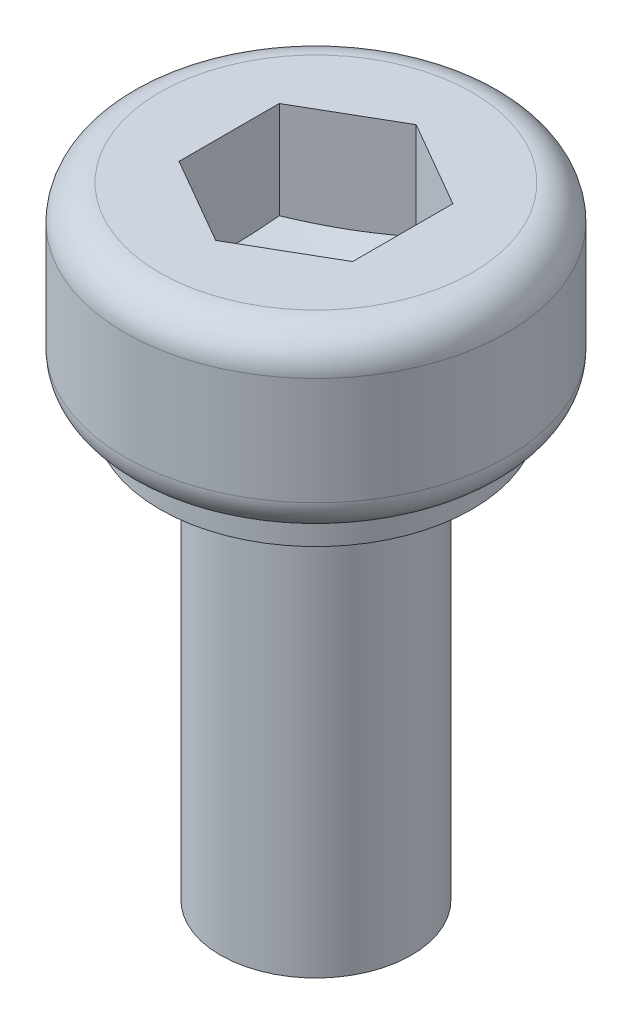
ISO-10303-21;
HEADER;
FILE_DESCRIPTION(('STEP AP214'),'2;1');
FILE_NAME('part.step','',(''),(''),'','','');
FILE_SCHEMA(('AUTOMOTIVE_DESIGN { 1 0 10303 214 1 1 1 1 }'));
ENDSEC;
DATA;
#1=APPLICATION_CONTEXT('core data for automotive mechanical design processes');
#2=APPLICATION_PROTOCOL_DEFINITION('international standard','automotive_design',2000,#1);
#3=PRODUCT_CONTEXT('',#1,'mechanical');
#4=PRODUCT('Part','Part','',(#3));
#5=PRODUCT_RELATED_PRODUCT_CATEGORY('part','',(#4));
#6=PRODUCT_DEFINITION_FORMATION('','',#4);
#7=PRODUCT_DEFINITION_CONTEXT('part definition',#1,'design');
#8=PRODUCT_DEFINITION('design','',#6,#7);
#9=PRODUCT_DEFINITION_SHAPE('','',#8);
#10=(LENGTH_UNIT() NAMED_UNIT(*) SI_UNIT(.MILLI.,.METRE.));
#11=(NAMED_UNIT(*) PLANE_ANGLE_UNIT() SI_UNIT($,.RADIAN.));
#12=(NAMED_UNIT(*) SI_UNIT($,.STERADIAN.) SOLID_ANGLE_UNIT());
#13=UNCERTAINTY_MEASURE_WITH_UNIT(LENGTH_MEASURE(1.E-05),#10,'distance_accuracy_value','');
#14=(GEOMETRIC_REPRESENTATION_CONTEXT(3) GLOBAL_UNCERTAINTY_ASSIGNED_CONTEXT((#13)) GLOBAL_UNIT_ASSIGNED_CONTEXT((#10,
#11,#12)) REPRESENTATION_CONTEXT('',''));
#15=CARTESIAN_POINT('',(0.,0.,0.));
#16=DIRECTION('',(0.,0.,1.));
#17=DIRECTION('',(1.,0.,0.));
#18=AXIS2_PLACEMENT_3D('',#15,#16,#17);
#19=CARTESIAN_POINT('',(0.,4.475,0.));
#20=DIRECTION('',(0.,-1.,0.));
#21=DIRECTION('',(0.,0.,-1.));
#22=AXIS2_PLACEMENT_3D('',#19,#20,#21);
#23=PLANE('',#22);
#24=DIRECTION('',(-0.866025403784439,0.,0.5));
#25=VECTOR('',#24,1.);
#26=CARTESIAN_POINT('',(0.,4.475,-1.44337567297406));
#27=LINE('',#26,#25);
#28=CARTESIAN_POINT('',(0.,4.475,-1.44337567297406));
#29=VERTEX_POINT('',#28);
#30=CARTESIAN_POINT('',(-1.25,4.475,-0.721687836487033));
#31=VERTEX_POINT('',#30);
#32=EDGE_CURVE('E206',#29,#31,#27,.T.);
#33=ORIENTED_EDGE('',*,*,#32,.F.);
#34=DIRECTION('',(-0.866025403784439,0.,-0.5));
#35=VECTOR('',#34,1.);
#36=CARTESIAN_POINT('',(1.25,4.475,-0.721687836487033));
#37=LINE('',#36,#35);
#38=CARTESIAN_POINT('',(1.25,4.475,-0.721687836487033));
#39=VERTEX_POINT('',#38);
#40=EDGE_CURVE('E61',#39,#29,#37,.T.);
#41=ORIENTED_EDGE('',*,*,#40,.F.);
#42=DIRECTION('',(0.,0.,-1.));
#43=VECTOR('',#42,1.);
#44=CARTESIAN_POINT('',(1.25,4.475,0.721687836487033));
#45=LINE('',#44,#43);
#46=CARTESIAN_POINT('',(1.25,4.475,0.721687836487033));
#47=VERTEX_POINT('',#46);
#48=EDGE_CURVE('E120',#47,#39,#45,.T.);
#49=ORIENTED_EDGE('',*,*,#48,.F.);
#50=DIRECTION('',(0.866025403784439,0.,-0.5));
#51=VECTOR('',#50,1.);
#52=CARTESIAN_POINT('',(0.,4.475,1.44337567297406));
#53=LINE('',#52,#51);
#54=CARTESIAN_POINT('',(0.,4.475,1.44337567297406));
#55=VERTEX_POINT('',#54);
#56=EDGE_CURVE('E125',#55,#47,#53,.T.);
#57=ORIENTED_EDGE('',*,*,#56,.F.);
#58=DIRECTION('',(0.866025403784439,0.,0.5));
#59=VECTOR('',#58,1.);
#60=CARTESIAN_POINT('',(-1.25,4.475,0.721687836487033));
#61=LINE('',#60,#59);
#62=CARTESIAN_POINT('',(-1.25,4.475,0.721687836487033));
#63=VERTEX_POINT('',#62);
#64=EDGE_CURVE('E373',#63,#55,#61,.T.);
#65=ORIENTED_EDGE('',*,*,#64,.F.);
#66=DIRECTION('',(0.,0.,1.));
#67=VECTOR('',#66,1.);
#68=CARTESIAN_POINT('',(-1.25,4.475,-0.721687836487033));
#69=LINE('',#68,#67);
#70=EDGE_CURVE('E381',#31,#63,#69,.T.);
#71=ORIENTED_EDGE('',*,*,#70,.F.);
#72=EDGE_LOOP('',(#33,#41,#49,#57,#65,#71));
#73=FACE_BOUND('',#72,.T.);
#74=CARTESIAN_POINT('',(0.,4.475,0.));
#75=DIRECTION('',(0.,1.,0.));
#76=DIRECTION('',(0.,0.,1.));
#77=AXIS2_PLACEMENT_3D('',#74,#75,#76);
#78=CIRCLE('',#77,2.25);
#79=CARTESIAN_POINT('',(0.,4.475,2.25));
#80=VERTEX_POINT('',#79);
#81=EDGE_CURVE('E11',#80,#80,#78,.T.);
#82=ORIENTED_EDGE('',*,*,#81,.T.);
#83=EDGE_LOOP('',(#82));
#84=FACE_BOUND('',#83,.T.);
#85=ADVANCED_FACE('F47',(#73,#84),#23,.F.);
#86=CARTESIAN_POINT('',(0.,3.975,0.));
#87=DIRECTION('',(0.,1.,0.));
#88=DIRECTION('',(0.,0.,1.));
#89=AXIS2_PLACEMENT_3D('',#86,#87,#88);
#90=TOROIDAL_SURFACE('',#89,2.25,0.5);
#91=ORIENTED_EDGE('',*,*,#81,.F.);
#92=EDGE_LOOP('',(#91));
#93=FACE_BOUND('',#92,.T.);
#94=CARTESIAN_POINT('',(0.,3.975,0.));
#95=DIRECTION('',(0.,1.,0.));
#96=DIRECTION('',(0.,0.,1.));
#97=AXIS2_PLACEMENT_3D('',#94,#95,#96);
#98=CIRCLE('',#97,2.75);
#99=CARTESIAN_POINT('',(0.,3.975,2.75));
#100=VERTEX_POINT('',#99);
#101=EDGE_CURVE('E54',#100,#100,#98,.T.);
#102=ORIENTED_EDGE('',*,*,#101,.T.);
#103=EDGE_LOOP('',(#102));
#104=FACE_BOUND('',#103,.T.);
#105=ADVANCED_FACE('F197',(#93,#104),#90,.T.);
#106=CARTESIAN_POINT('',(0.,4.09422492401216,0.));
#107=DIRECTION('',(0.,1.,0.));
#108=DIRECTION('',(0.,0.,1.));
#109=AXIS2_PLACEMENT_3D('',#106,#107,#108);
#110=CYLINDRICAL_SURFACE('',#109,2.75);
#111=ORIENTED_EDGE('',*,*,#101,.F.);
#112=EDGE_LOOP('',(#111));
#113=FACE_BOUND('',#112,.T.);
#114=CARTESIAN_POINT('',(0.,2.425,0.));
#115=DIRECTION('',(0.,1.,0.));
#116=DIRECTION('',(0.,0.,1.));
#117=AXIS2_PLACEMENT_3D('',#114,#115,#116);
#118=CIRCLE('',#117,2.75);
#119=CARTESIAN_POINT('',(0.,2.425,2.75));
#120=VERTEX_POINT('',#119);
#121=EDGE_CURVE('E212',#120,#120,#118,.T.);
#122=ORIENTED_EDGE('',*,*,#121,.T.);
#123=EDGE_LOOP('',(#122));
#124=FACE_BOUND('',#123,.T.);
#125=ADVANCED_FACE('F202',(#113,#124),#110,.T.);
#126=CARTESIAN_POINT('',(0.,2.425,0.));
#127=DIRECTION('',(0.,1.,0.));
#128=DIRECTION('',(0.,0.,1.));
#129=AXIS2_PLACEMENT_3D('',#126,#127,#128);
#130=TOROIDAL_SURFACE('',#129,2.25,0.5);
#131=ORIENTED_EDGE('',*,*,#121,.F.);
#132=EDGE_LOOP('',(#131));
#133=FACE_BOUND('',#132,.T.);
#134=CARTESIAN_POINT('',(0.,1.925,0.));
#135=DIRECTION('',(0.,1.,0.));
#136=DIRECTION('',(0.,0.,1.));
#137=AXIS2_PLACEMENT_3D('',#134,#135,#136);
#138=CIRCLE('',#137,2.25);
#139=CARTESIAN_POINT('',(0.,1.925,2.25));
#140=VERTEX_POINT('',#139);
#141=EDGE_CURVE('E214',#140,#140,#138,.T.);
#142=ORIENTED_EDGE('',*,*,#141,.T.);
#143=EDGE_LOOP('',(#142));
#144=FACE_BOUND('',#143,.T.);
#145=ADVANCED_FACE('F247',(#133,#144),#130,.T.);
#146=CARTESIAN_POINT('',(0.,4.09422492401216,0.));
#147=DIRECTION('',(0.,1.,0.));
#148=DIRECTION('',(0.,0.,1.));
#149=AXIS2_PLACEMENT_3D('',#146,#147,#148);
#150=CYLINDRICAL_SURFACE('',#149,2.25);
#151=ORIENTED_EDGE('',*,*,#141,.F.);
#152=EDGE_LOOP('',(#151));
#153=FACE_BOUND('',#152,.T.);
#154=CARTESIAN_POINT('',(0.,1.525,0.));
#155=DIRECTION('',(0.,1.,0.));
#156=DIRECTION('',(0.,0.,1.));
#157=AXIS2_PLACEMENT_3D('',#154,#155,#156);
#158=CIRCLE('',#157,2.25);
#159=CARTESIAN_POINT('',(0.,1.525,2.25));
#160=VERTEX_POINT('',#159);
#161=EDGE_CURVE('E219',#160,#160,#158,.T.);
#162=ORIENTED_EDGE('',*,*,#161,.T.);
#163=EDGE_LOOP('',(#162));
#164=FACE_BOUND('',#163,.T.);
#165=ADVANCED_FACE('F243',(#153,#164),#150,.T.);
#166=CARTESIAN_POINT('',(2.25,1.525,0.));
#167=DIRECTION('',(0.,1.,0.));
#168=DIRECTION('',(0.,0.,1.));
#169=AXIS2_PLACEMENT_3D('',#166,#167,#168);
#170=PLANE('',#169);
#171=ORIENTED_EDGE('',*,*,#161,.F.);
#172=EDGE_LOOP('',(#171));
#173=FACE_BOUND('',#172,.T.);
#174=CARTESIAN_POINT('',(0.,1.525,0.));
#175=DIRECTION('',(0.,1.,0.));
#176=DIRECTION('',(0.,0.,1.));
#177=AXIS2_PLACEMENT_3D('',#174,#175,#176);
#178=CIRCLE('',#177,1.375);
#179=CARTESIAN_POINT('',(0.,1.525,1.375));
#180=VERTEX_POINT('',#179);
#181=EDGE_CURVE('E221',#180,#180,#178,.T.);
#182=ORIENTED_EDGE('',*,*,#181,.T.);
#183=EDGE_LOOP('',(#182));
#184=FACE_BOUND('',#183,.T.);
#185=ADVANCED_FACE('F236',(#173,#184),#170,.F.);
#186=CARTESIAN_POINT('',(0.,4.09422492401216,0.));
#187=DIRECTION('',(0.,1.,0.));
#188=DIRECTION('',(0.,0.,1.));
#189=AXIS2_PLACEMENT_3D('',#186,#187,#188);
#190=CYLINDRICAL_SURFACE('',#189,1.375);
#191=ORIENTED_EDGE('',*,*,#181,.F.);
#192=EDGE_LOOP('',(#191));
#193=FACE_BOUND('',#192,.T.);
#194=CARTESIAN_POINT('',(0.,-4.475,0.));
#195=DIRECTION('',(0.,1.,0.));
#196=DIRECTION('',(0.,0.,1.));
#197=AXIS2_PLACEMENT_3D('',#194,#195,#196);
#198=CIRCLE('',#197,1.375);
#199=CARTESIAN_POINT('',(0.,-4.475,1.375));
#200=VERTEX_POINT('',#199);
#201=EDGE_CURVE('E108',#200,#200,#198,.T.);
#202=ORIENTED_EDGE('',*,*,#201,.T.);
#203=EDGE_LOOP('',(#202));
#204=FACE_BOUND('',#203,.T.);
#205=ADVANCED_FACE('F228',(#193,#204),#190,.T.);
#206=CARTESIAN_POINT('',(1.375,-4.475,0.));
#207=DIRECTION('',(0.,1.,0.));
#208=DIRECTION('',(0.,0.,1.));
#209=AXIS2_PLACEMENT_3D('',#206,#207,#208);
#210=PLANE('',#209);
#211=ORIENTED_EDGE('',*,*,#201,.F.);
#212=EDGE_LOOP('',(#211));
#213=FACE_BOUND('',#212,.T.);
#214=ADVANCED_FACE('F230',(#213),#210,.F.);
#215=CARTESIAN_POINT('',(1.25,2.475,-0.721687836487033));
#216=DIRECTION('',(0.5,0.,-0.866025403784439));
#217=DIRECTION('',(-0.866025403784439,0.,-0.5));
#218=AXIS2_PLACEMENT_3D('',#215,#216,#217);
#219=PLANE('',#218);
#220=CARTESIAN_POINT('',(-0.000199999999999668,3.07502213659224,-1.4434911430279));
#221=CARTESIAN_POINT('',(0.0518104295641314,3.06926246143579,-1.41346290751838));
#222=CARTESIAN_POINT('',(0.103869536937207,3.06403974723522,-1.38340656786277));
#223=CARTESIAN_POINT('',(0.208081999228773,3.05487120303171,-1.32323947470582));
#224=CARTESIAN_POINT('',(0.260235371100698,3.05092563186543,-1.29312871141642));
#225=CARTESIAN_POINT('',(0.364473709342653,3.0445253362828,-1.23294667877254));
#226=CARTESIAN_POINT('',(0.416558490077755,3.04206668415272,-1.20287551659445));
#227=CARTESIAN_POINT('',(0.520762183051685,3.03877043652459,-1.1427134864054));
#228=CARTESIAN_POINT('',(0.572881091525842,3.03793268513289,-1.11262262056797));
#229=CARTESIAN_POINT('',(0.677118908474158,3.03793268513289,-1.05244088889312));
#230=CARTESIAN_POINT('',(0.729237816948315,3.03877043652459,-1.0223500230557));
#231=CARTESIAN_POINT('',(0.833441509922245,3.04206668415272,-0.962187992866648));
#232=CARTESIAN_POINT('',(0.885526290657347,3.0445253362828,-0.932116830688555));
#233=CARTESIAN_POINT('',(0.989764628899303,3.05092563186543,-0.871934798044682));
#234=CARTESIAN_POINT('',(1.04191800077123,3.05487120303171,-0.84182403475528));
#235=CARTESIAN_POINT('',(1.14613046306279,3.06403974723522,-0.781656941598331));
#236=CARTESIAN_POINT('',(1.19818957043587,3.06926246143579,-0.751600601942714));
#237=CARTESIAN_POINT('',(1.2502,3.07502213659224,-0.721572366433195));
#238=B_SPLINE_CURVE_WITH_KNOTS('',3,(#220,#221,#222,#223,#224,#225,#226,#227,#228,#229,#230,
#231,#232,#233,#234,#235,#236,#237),.UNSPECIFIED.,.F.,.F.,(4,2,2,2,2,2,2,2,4),(0.,
0.181000745388271,0.362038150988404,0.542595231362164,0.723134945402974,0.903674659443784,
1.08423173981754,1.26526914541768,1.44626989080595),.UNSPECIFIED.);
#239=CARTESIAN_POINT('',(0.,3.075,-1.44337567297406));
#240=VERTEX_POINT('',#239);
#241=CARTESIAN_POINT('',(1.25,3.075,-0.721687836487033));
#242=VERTEX_POINT('',#241);
#243=EDGE_CURVE('E112',#240,#242,#238,.T.);
#244=ORIENTED_EDGE('',*,*,#243,.T.);
#245=DIRECTION('',(0.,1.,0.));
#246=VECTOR('',#245,1.);
#247=CARTESIAN_POINT('',(1.25,2.475,-0.721687836487033));
#248=LINE('',#247,#246);
#249=EDGE_CURVE('E109',#242,#39,#248,.T.);
#250=ORIENTED_EDGE('',*,*,#249,.T.);
#251=ORIENTED_EDGE('',*,*,#40,.T.);
#252=DIRECTION('',(0.,1.,0.));
#253=VECTOR('',#252,1.);
#254=CARTESIAN_POINT('',(0.,2.475,-1.44337567297406));
#255=LINE('',#254,#253);
#256=EDGE_CURVE('E104',#240,#29,#255,.T.);
#257=ORIENTED_EDGE('',*,*,#256,.F.);
#258=EDGE_LOOP('',(#244,#250,#251,#257));
#259=FACE_BOUND('',#258,.T.);
#260=ADVANCED_FACE('F119',(#259),#219,.F.);
#261=CARTESIAN_POINT('',(1.25,2.475,0.721687836487033));
#262=DIRECTION('',(1.,0.,0.));
#263=DIRECTION('',(0.,0.,-1.));
#264=AXIS2_PLACEMENT_3D('',#261,#262,#263);
#265=PLANE('',#264);
#266=CARTESIAN_POINT('',(1.25,3.27986393266067,-2.17905403611333));
#267=CARTESIAN_POINT('',(1.25,3.26241167422932,-2.07395009860659));
#268=CARTESIAN_POINT('',(1.25,3.24522032681984,-1.96879996781174));
#269=CARTESIAN_POINT('',(1.25,3.21170531820386,-1.75835059041696));
#270=CARTESIAN_POINT('',(1.25,3.1953817490476,-1.65305132920933));
#271=CARTESIAN_POINT('',(1.25,3.16387651632622,-1.44176294489903));
#272=CARTESIAN_POINT('',(1.25,3.14870071461258,-1.33577293769499));
#273=CARTESIAN_POINT('',(1.25,3.12016928542285,-1.12353979169023));
#274=CARTESIAN_POINT('',(1.25,3.10681373080936,-1.01729664292962));
#275=CARTESIAN_POINT('',(1.25,3.08296213919632,-0.806005172192661));
#276=CARTESIAN_POINT('',(1.25,3.0724282853726,-0.700961236680108));
#277=CARTESIAN_POINT('',(1.25,3.05508287381985,-0.490567790876243));
#278=CARTESIAN_POINT('',(1.25,3.04827077429862,-0.385218327307928));
#279=CARTESIAN_POINT('',(1.25,3.03946010519578,-0.17454649009671));
#280=CARTESIAN_POINT('',(1.25,3.03745059762555,-0.0692246022002252));
#281=CARTESIAN_POINT('',(1.25,3.03861439807438,0.141392413524246));
#282=CARTESIAN_POINT('',(1.25,3.04178784167731,0.246687540580113));
#283=CARTESIAN_POINT('',(1.25,3.0511996283626,0.428094047279162));
#284=CARTESIAN_POINT('',(1.25,3.05635479919092,0.504266022941));
#285=CARTESIAN_POINT('',(1.25,3.06864181101614,0.656446776567248));
#286=CARTESIAN_POINT('',(1.25,3.0757736272437,0.732455556564635));
#287=CARTESIAN_POINT('',(1.25,3.09949527042362,0.960485133272154));
#288=CARTESIAN_POINT('',(1.25,3.11839567377015,1.11226253619117));
#289=CARTESIAN_POINT('',(1.25,3.14949527165966,1.34036100724888));
#290=CARTESIAN_POINT('',(1.25,3.16038509955885,1.41687238761891));
#291=CARTESIAN_POINT('',(1.25,3.18286077200284,1.56979468542723));
#292=CARTESIAN_POINT('',(1.25,3.19444662073168,1.64620560225877));
#293=CARTESIAN_POINT('',(1.25,3.21810928108022,1.7987279380359));
#294=CARTESIAN_POINT('',(1.25,3.2301846025663,1.87483959068598));
#295=CARTESIAN_POINT('',(1.25,3.25474485969705,2.02699389967147));
#296=CARTESIAN_POINT('',(1.25,3.26722977968569,2.10303655853011));
#297=CARTESIAN_POINT('',(1.25,3.27986393266068,2.17905403611333));
#298=B_SPLINE_CURVE_WITH_KNOTS('',3,(#266,#267,#268,#269,#270,#271,#272,#273,#274,#275,#276,
#277,#278,#279,#280,#281,#282,#283,#284,#285,#286,#287,#288,#289,#290,#291,#292,#293,#294,#295,
#296,#297),.UNSPECIFIED.,.F.,.F.,(4,2,2,2,2,2,2,2,2,2,2,2,2,2,2,4),(0.,0.319633094293302,
0.639300026536296,0.960502494708345,1.28171781650624,1.59838422210634,1.91500451689018,
2.23090301324148,2.54680977350041,2.77582029179633,3.00482794049193,3.46358394927292,
3.69543178901939,3.92728102262634,4.15847082499726,4.38965180089788),.UNSPECIFIED.);
#299=CARTESIAN_POINT('',(1.25,3.075,0.721687836487033));
#300=VERTEX_POINT('',#299);
#301=EDGE_CURVE('E116',#242,#300,#298,.T.);
#302=ORIENTED_EDGE('',*,*,#301,.T.);
#303=DIRECTION('',(0.,1.,0.));
#304=VECTOR('',#303,1.);
#305=CARTESIAN_POINT('',(1.25,2.475,0.721687836487033));
#306=LINE('',#305,#304);
#307=EDGE_CURVE('E371',#300,#47,#306,.T.);
#308=ORIENTED_EDGE('',*,*,#307,.T.);
#309=ORIENTED_EDGE('',*,*,#48,.T.);
#310=ORIENTED_EDGE('',*,*,#249,.F.);
#311=EDGE_LOOP('',(#302,#308,#309,#310));
#312=FACE_BOUND('',#311,.T.);
#313=ADVANCED_FACE('F179',(#312),#265,.F.);
#314=CARTESIAN_POINT('',(0.,2.475,1.44337567297406));
#315=DIRECTION('',(0.5,0.,0.866025403784439));
#316=DIRECTION('',(0.866025403784439,0.,-0.5));
#317=AXIS2_PLACEMENT_3D('',#314,#315,#316);
#318=PLANE('',#317);
#319=CARTESIAN_POINT('',(1.2502,3.07502213659224,0.721572366433195));
#320=CARTESIAN_POINT('',(1.19818957043587,3.06926246143579,0.751600601942714));
#321=CARTESIAN_POINT('',(1.14613046306279,3.06403974723522,0.781656941598331));
#322=CARTESIAN_POINT('',(1.04191800077123,3.05487120303171,0.84182403475528));
#323=CARTESIAN_POINT('',(0.989764628899302,3.05092563186543,0.871934798044683));
#324=CARTESIAN_POINT('',(0.885526290657347,3.0445253362828,0.932116830688555));
#325=CARTESIAN_POINT('',(0.833441509922245,3.04206668415272,0.962187992866649));
#326=CARTESIAN_POINT('',(0.729237816948315,3.03877043652459,1.0223500230557));
#327=CARTESIAN_POINT('',(0.677118908474157,3.03793268513289,1.05244088889312));
#328=CARTESIAN_POINT('',(0.572881091525842,3.03793268513289,1.11262262056797));
#329=CARTESIAN_POINT('',(0.520762183051684,3.03877043652459,1.1427134864054));
#330=CARTESIAN_POINT('',(0.416558490077755,3.04206668415272,1.20287551659445));
#331=CARTESIAN_POINT('',(0.364473709342653,3.0445253362828,1.23294667877254));
#332=CARTESIAN_POINT('',(0.260235371100697,3.05092563186543,1.29312871141642));
#333=CARTESIAN_POINT('',(0.208081999228772,3.05487120303171,1.32323947470582));
#334=CARTESIAN_POINT('',(0.103869536937207,3.06403974723522,1.38340656786277));
#335=CARTESIAN_POINT('',(0.0518104295641309,3.06926246143579,1.41346290751838));
#336=CARTESIAN_POINT('',(-0.000200000000000066,3.07502213659224,1.4434911430279));
#337=B_SPLINE_CURVE_WITH_KNOTS('',3,(#319,#320,#321,#322,#323,#324,#325,#326,#327,#328,#329,
#330,#331,#332,#333,#334,#335,#336),.UNSPECIFIED.,.F.,.F.,(4,2,2,2,2,2,2,2,4),(0.,
0.181000745388271,0.362038150988404,0.542595231362164,0.723134945402974,0.903674659443784,
1.08423173981754,1.26526914541768,1.44626989080595),.UNSPECIFIED.);
#338=CARTESIAN_POINT('',(0.,3.075,1.44337567297406));
#339=VERTEX_POINT('',#338);
#340=EDGE_CURVE('E163',#300,#339,#337,.T.);
#341=ORIENTED_EDGE('',*,*,#340,.T.);
#342=DIRECTION('',(0.,1.,0.));
#343=VECTOR('',#342,1.);
#344=CARTESIAN_POINT('',(0.,2.475,1.44337567297406));
#345=LINE('',#344,#343);
#346=EDGE_CURVE('E369',#339,#55,#345,.T.);
#347=ORIENTED_EDGE('',*,*,#346,.T.);
#348=ORIENTED_EDGE('',*,*,#56,.T.);
#349=ORIENTED_EDGE('',*,*,#307,.F.);
#350=EDGE_LOOP('',(#341,#347,#348,#349));
#351=FACE_BOUND('',#350,.T.);
#352=ADVANCED_FACE('F182',(#351),#318,.F.);
#353=CARTESIAN_POINT('',(-1.25,2.475,0.721687836487033));
#354=DIRECTION('',(-0.5,0.,0.866025403784439));
#355=DIRECTION('',(0.866025403784439,0.,0.5));
#356=AXIS2_PLACEMENT_3D('',#353,#354,#355);
#357=PLANE('',#356);
#358=CARTESIAN_POINT('',(0.000199999999999786,3.07502213659224,1.4434911430279));
#359=CARTESIAN_POINT('',(-0.0518104295641313,3.06926246143579,1.41346290751838));
#360=CARTESIAN_POINT('',(-0.103869536937207,3.06403974723522,1.38340656786277));
#361=CARTESIAN_POINT('',(-0.208081999228772,3.05487120303171,1.32323947470582));
#362=CARTESIAN_POINT('',(-0.260235371100697,3.05092563186543,1.29312871141641));
#363=CARTESIAN_POINT('',(-0.364473709342653,3.0445253362828,1.23294667877254));
#364=CARTESIAN_POINT('',(-0.416558490077755,3.04206668415272,1.20287551659445));
#365=CARTESIAN_POINT('',(-0.520762183051685,3.03877043652459,1.1427134864054));
#366=CARTESIAN_POINT('',(-0.572881091525842,3.03793268513289,1.11262262056797));
#367=CARTESIAN_POINT('',(-0.677118908474158,3.03793268513289,1.05244088889312));
#368=CARTESIAN_POINT('',(-0.729237816948315,3.03877043652459,1.0223500230557));
#369=CARTESIAN_POINT('',(-0.833441509922245,3.04206668415272,0.962187992866649));
#370=CARTESIAN_POINT('',(-0.885526290657347,3.0445253362828,0.932116830688555));
#371=CARTESIAN_POINT('',(-0.989764628899303,3.05092563186543,0.871934798044682));
#372=CARTESIAN_POINT('',(-1.04191800077123,3.05487120303171,0.84182403475528));
#373=CARTESIAN_POINT('',(-1.14613046306279,3.06403974723522,0.781656941598331));
#374=CARTESIAN_POINT('',(-1.19818957043587,3.06926246143579,0.751600601942714));
#375=CARTESIAN_POINT('',(-1.2502,3.07502213659224,0.721572366433195));
#376=B_SPLINE_CURVE_WITH_KNOTS('',3,(#358,#359,#360,#361,#362,#363,#364,#365,#366,#367,#368,
#369,#370,#371,#372,#373,#374,#375),.UNSPECIFIED.,.F.,.F.,(4,2,2,2,2,2,2,2,4),(0.,
0.181000745388271,0.362038150988405,0.542595231362164,0.723134945402974,0.903674659443784,
1.08423173981754,1.26526914541768,1.44626989080595),.UNSPECIFIED.);
#377=CARTESIAN_POINT('',(-1.25,3.075,0.721687836487032));
#378=VERTEX_POINT('',#377);
#379=EDGE_CURVE('E156',#339,#378,#376,.T.);
#380=ORIENTED_EDGE('',*,*,#379,.T.);
#381=DIRECTION('',(0.,1.,0.));
#382=VECTOR('',#381,1.);
#383=CARTESIAN_POINT('',(-1.25,2.475,0.721687836487033));
#384=LINE('',#383,#382);
#385=EDGE_CURVE('E122',#378,#63,#384,.T.);
#386=ORIENTED_EDGE('',*,*,#385,.T.);
#387=ORIENTED_EDGE('',*,*,#64,.T.);
#388=ORIENTED_EDGE('',*,*,#346,.F.);
#389=EDGE_LOOP('',(#380,#386,#387,#388));
#390=FACE_BOUND('',#389,.T.);
#391=ADVANCED_FACE('F186',(#390),#357,.F.);
#392=CARTESIAN_POINT('',(-1.25,2.475,-0.721687836487033));
#393=DIRECTION('',(-1.,0.,0.));
#394=DIRECTION('',(0.,0.,1.));
#395=AXIS2_PLACEMENT_3D('',#392,#393,#394);
#396=PLANE('',#395);
#397=CARTESIAN_POINT('',(-1.25,3.27986393266068,2.17905403611333));
#398=CARTESIAN_POINT('',(-1.25,3.26241167422932,2.07395009860659));
#399=CARTESIAN_POINT('',(-1.25,3.24522032681985,1.96879996781174));
#400=CARTESIAN_POINT('',(-1.25,3.21170531820386,1.75835059041696));
#401=CARTESIAN_POINT('',(-1.25,3.19538174904761,1.65305132920933));
#402=CARTESIAN_POINT('',(-1.25,3.16387651632622,1.44176294489903));
#403=CARTESIAN_POINT('',(-1.25,3.14870071461258,1.33577293769499));
#404=CARTESIAN_POINT('',(-1.25,3.12016928542285,1.12353979169023));
#405=CARTESIAN_POINT('',(-1.25,3.10681373080936,1.01729664292962));
#406=CARTESIAN_POINT('',(-1.25,3.08296213919632,0.80600517219266));
#407=CARTESIAN_POINT('',(-1.25,3.0724282853726,0.700961236680107));
#408=CARTESIAN_POINT('',(-1.25,3.05508287381985,0.490567790876242));
#409=CARTESIAN_POINT('',(-1.25,3.04827077429862,0.385218327307926));
#410=CARTESIAN_POINT('',(-1.25,3.03946010519578,0.174546490096708));
#411=CARTESIAN_POINT('',(-1.25,3.03745059762555,0.0692246022002236));
#412=CARTESIAN_POINT('',(-1.25,3.03861439807438,-0.141392413524248));
#413=CARTESIAN_POINT('',(-1.25,3.04178784167731,-0.246687540580115));
#414=CARTESIAN_POINT('',(-1.25,3.0511996283626,-0.428094047279164));
#415=CARTESIAN_POINT('',(-1.25,3.05635479919092,-0.504266022941001));
#416=CARTESIAN_POINT('',(-1.25,3.06864181101614,-0.656446776567249));
#417=CARTESIAN_POINT('',(-1.25,3.0757736272437,-0.732455556564637));
#418=CARTESIAN_POINT('',(-1.25,3.09949527042362,-0.960485133272155));
#419=CARTESIAN_POINT('',(-1.25,3.11839567377015,-1.11226253619117));
#420=CARTESIAN_POINT('',(-1.25,3.14949527165966,-1.34036100724888));
#421=CARTESIAN_POINT('',(-1.25,3.16038509955885,-1.41687238761891));
#422=CARTESIAN_POINT('',(-1.25,3.18286077200284,-1.56979468542722));
#423=CARTESIAN_POINT('',(-1.25,3.19444662073168,-1.64620560225877));
#424=CARTESIAN_POINT('',(-1.25,3.21810928108022,-1.7987279380359));
#425=CARTESIAN_POINT('',(-1.25,3.2301846025663,-1.87483959068598));
#426=CARTESIAN_POINT('',(-1.25,3.25474485969705,-2.02699389967147));
#427=CARTESIAN_POINT('',(-1.25,3.26722977968569,-2.10303655853011));
#428=CARTESIAN_POINT('',(-1.25,3.27986393266067,-2.17905403611333));
#429=B_SPLINE_CURVE_WITH_KNOTS('',3,(#397,#398,#399,#400,#401,#402,#403,#404,#405,#406,#407,
#408,#409,#410,#411,#412,#413,#414,#415,#416,#417,#418,#419,#420,#421,#422,#423,#424,#425,#426,
#427,#428),.UNSPECIFIED.,.F.,.F.,(4,2,2,2,2,2,2,2,2,2,2,2,2,2,2,4),(0.,0.319633094293302,
0.639300026536296,0.960502494708346,1.28171781650624,1.59838422210634,1.91500451689018,
2.23090301324148,2.54680977350041,2.77582029179634,3.00482794049193,3.46358394927292,
3.69543178901939,3.92728102262634,4.15847082499726,4.38965180089787),.UNSPECIFIED.);
#430=CARTESIAN_POINT('',(-1.25,3.075,-0.721687836487033));
#431=VERTEX_POINT('',#430);
#432=EDGE_CURVE('E69',#378,#431,#429,.T.);
#433=ORIENTED_EDGE('',*,*,#432,.T.);
#434=DIRECTION('',(0.,1.,0.));
#435=VECTOR('',#434,1.);
#436=CARTESIAN_POINT('',(-1.25,2.475,-0.721687836487033));
#437=LINE('',#436,#435);
#438=EDGE_CURVE('E106',#431,#31,#437,.T.);
#439=ORIENTED_EDGE('',*,*,#438,.T.);
#440=ORIENTED_EDGE('',*,*,#70,.T.);
#441=ORIENTED_EDGE('',*,*,#385,.F.);
#442=EDGE_LOOP('',(#433,#439,#440,#441));
#443=FACE_BOUND('',#442,.T.);
#444=ADVANCED_FACE('F190',(#443),#396,.F.);
#445=CARTESIAN_POINT('',(0.,2.475,-1.44337567297406));
#446=DIRECTION('',(-0.5,0.,-0.866025403784439));
#447=DIRECTION('',(-0.866025403784439,0.,0.5));
#448=AXIS2_PLACEMENT_3D('',#445,#446,#447);
#449=PLANE('',#448);
#450=CARTESIAN_POINT('',(-1.2502,3.07502213659224,-0.721572366433195));
#451=CARTESIAN_POINT('',(-1.19818957043587,3.06926246143579,-0.751600601942714));
#452=CARTESIAN_POINT('',(-1.14613046306279,3.06403974723522,-0.781656941598331));
#453=CARTESIAN_POINT('',(-1.04191800077123,3.05487120303171,-0.84182403475528));
#454=CARTESIAN_POINT('',(-0.989764628899302,3.05092563186543,-0.871934798044683));
#455=CARTESIAN_POINT('',(-0.885526290657347,3.0445253362828,-0.932116830688555));
#456=CARTESIAN_POINT('',(-0.833441509922245,3.04206668415272,-0.962187992866649));
#457=CARTESIAN_POINT('',(-0.729237816948315,3.03877043652459,-1.0223500230557));
#458=CARTESIAN_POINT('',(-0.677118908474157,3.03793268513289,-1.05244088889312));
#459=CARTESIAN_POINT('',(-0.572881091525842,3.03793268513289,-1.11262262056797));
#460=CARTESIAN_POINT('',(-0.520762183051684,3.03877043652459,-1.1427134864054));
#461=CARTESIAN_POINT('',(-0.416558490077755,3.04206668415272,-1.20287551659445));
#462=CARTESIAN_POINT('',(-0.364473709342652,3.0445253362828,-1.23294667877254));
#463=CARTESIAN_POINT('',(-0.260235371100697,3.05092563186543,-1.29312871141642));
#464=CARTESIAN_POINT('',(-0.208081999228772,3.05487120303171,-1.32323947470582));
#465=CARTESIAN_POINT('',(-0.103869536937206,3.06403974723522,-1.38340656786277));
#466=CARTESIAN_POINT('',(-0.0518104295641306,3.06926246143579,-1.41346290751838));
#467=CARTESIAN_POINT('',(0.000200000000000396,3.07502213659224,-1.4434911430279));
#468=B_SPLINE_CURVE_WITH_KNOTS('',3,(#450,#451,#452,#453,#454,#455,#456,#457,#458,#459,#460,
#461,#462,#463,#464,#465,#466,#467),.UNSPECIFIED.,.F.,.F.,(4,2,2,2,2,2,2,2,4),(0.,
0.181000745388271,0.362038150988405,0.542595231362164,0.723134945402975,0.903674659443785,
1.08423173981754,1.26526914541768,1.44626989080595),.UNSPECIFIED.);
#469=EDGE_CURVE('E100',#431,#240,#468,.T.);
#470=ORIENTED_EDGE('',*,*,#469,.T.);
#471=ORIENTED_EDGE('',*,*,#256,.T.);
#472=ORIENTED_EDGE('',*,*,#32,.T.);
#473=ORIENTED_EDGE('',*,*,#438,.F.);
#474=EDGE_LOOP('',(#470,#471,#472,#473));
#475=FACE_BOUND('',#474,.T.);
#476=ADVANCED_FACE('F102',(#475),#449,.F.);
#477=CARTESIAN_POINT('',(0.,2.875,0.));
#478=DIRECTION('',(0.,1.,0.));
#479=DIRECTION('',(0.,0.,1.));
#480=AXIS2_PLACEMENT_3D('',#477,#478,#479);
#481=PLANE('',#480);
#482=CARTESIAN_POINT('',(0.,2.875,0.));
#483=DIRECTION('',(0.,-1.,0.));
#484=DIRECTION('',(0.,0.,-1.));
#485=AXIS2_PLACEMENT_3D('',#482,#483,#484);
#486=CIRCLE('',#485,0.4);
#487=CARTESIAN_POINT('',(0.,2.875,-0.4));
#488=VERTEX_POINT('',#487);
#489=EDGE_CURVE('E364',#488,#488,#486,.T.);
#490=ORIENTED_EDGE('',*,*,#489,.F.);
#491=EDGE_LOOP('',(#490));
#492=FACE_BOUND('',#491,.T.);
#493=ADVANCED_FACE('F142',(#492),#481,.T.);
#494=CARTESIAN_POINT('',(0.,3.075,0.));
#495=DIRECTION('',(0.,1.,0.));
#496=DIRECTION('',(0.,0.,1.));
#497=AXIS2_PLACEMENT_3D('',#494,#495,#496);
#498=CONICAL_SURFACE('',#497,1.44337567297406,1.38140809939809);
#499=ORIENTED_EDGE('',*,*,#243,.F.);
#500=ORIENTED_EDGE('',*,*,#469,.F.);
#501=ORIENTED_EDGE('',*,*,#432,.F.);
#502=ORIENTED_EDGE('',*,*,#379,.F.);
#503=ORIENTED_EDGE('',*,*,#340,.F.);
#504=ORIENTED_EDGE('',*,*,#301,.F.);
#505=EDGE_LOOP('',(#499,#500,#501,#502,#503,#504));
#506=FACE_BOUND('',#505,.T.);
#507=ORIENTED_EDGE('',*,*,#489,.T.);
#508=EDGE_LOOP('',(#507));
#509=FACE_BOUND('',#508,.T.);
#510=ADVANCED_FACE('F113',(#506,#509),#498,.F.);
#511=CLOSED_SHELL('',(#85,#105,#125,#145,#165,#185,#205,#214,#260,#313,#352,#391,#444,#476,#493,#510));
#512=MANIFOLD_SOLID_BREP('B2',#511);
#513=ADVANCED_BREP_SHAPE_REPRESENTATION('',(#18,#512),#14);
#514=SHAPE_DEFINITION_REPRESENTATION(#9,#513);
ENDSEC;
END-ISO-10303-21;
